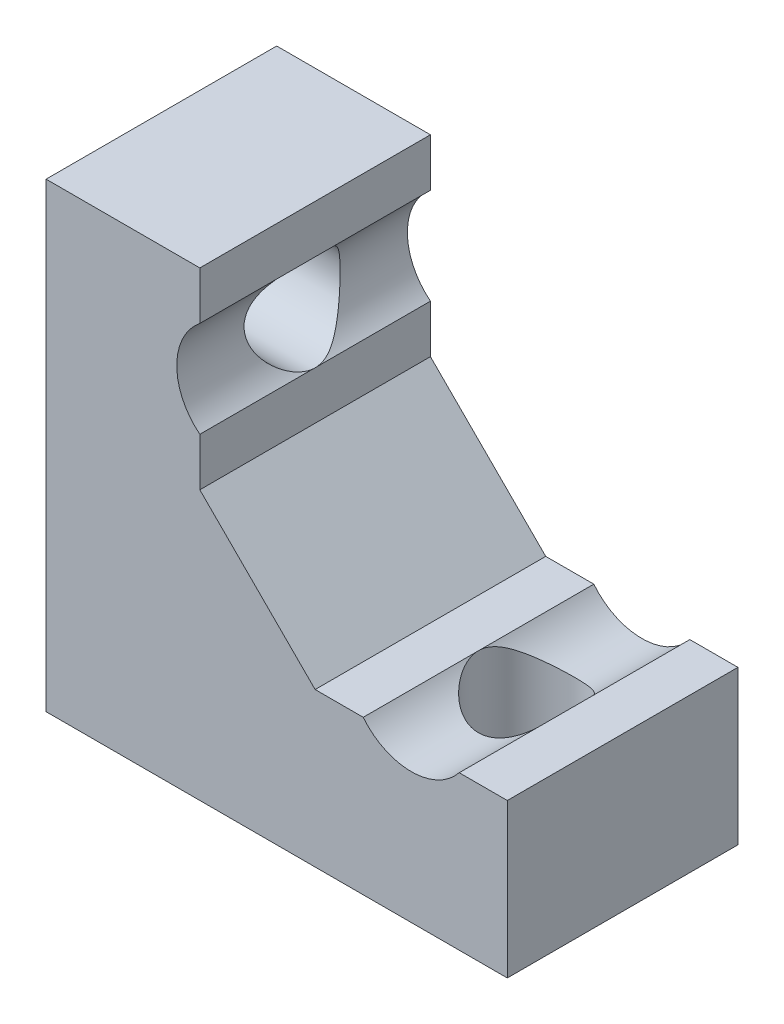
ISO-10303-21;
HEADER;
FILE_DESCRIPTION(('STEP AP214'),'2;1');
FILE_NAME('part.step','',(''),(''),'','','');
FILE_SCHEMA(('AUTOMOTIVE_DESIGN { 1 0 10303 214 1 1 1 1 }'));
ENDSEC;
DATA;
#1=APPLICATION_CONTEXT('core data for automotive mechanical design processes');
#2=APPLICATION_PROTOCOL_DEFINITION('international standard','automotive_design',2000,#1);
#3=PRODUCT_CONTEXT('',#1,'mechanical');
#4=PRODUCT('Part','Part','',(#3));
#5=PRODUCT_RELATED_PRODUCT_CATEGORY('part','',(#4));
#6=PRODUCT_DEFINITION_FORMATION('','',#4);
#7=PRODUCT_DEFINITION_CONTEXT('part definition',#1,'design');
#8=PRODUCT_DEFINITION('design','',#6,#7);
#9=PRODUCT_DEFINITION_SHAPE('','',#8);
#10=(LENGTH_UNIT() NAMED_UNIT(*) SI_UNIT(.MILLI.,.METRE.));
#11=(NAMED_UNIT(*) PLANE_ANGLE_UNIT() SI_UNIT($,.RADIAN.));
#12=(NAMED_UNIT(*) SI_UNIT($,.STERADIAN.) SOLID_ANGLE_UNIT());
#13=UNCERTAINTY_MEASURE_WITH_UNIT(LENGTH_MEASURE(1.E-05),#10,'distance_accuracy_value','');
#14=(GEOMETRIC_REPRESENTATION_CONTEXT(3) GLOBAL_UNCERTAINTY_ASSIGNED_CONTEXT((#13)) GLOBAL_UNIT_ASSIGNED_CONTEXT((#10,
#11,#12)) REPRESENTATION_CONTEXT('',''));
#15=CARTESIAN_POINT('',(0.,0.,0.));
#16=DIRECTION('',(0.,0.,1.));
#17=DIRECTION('',(1.,0.,0.));
#18=AXIS2_PLACEMENT_3D('',#15,#16,#17);
#19=CARTESIAN_POINT('',(12.,4.,6.));
#20=DIRECTION('',(0.,-1.,0.));
#21=DIRECTION('',(1.,0.,0.));
#22=AXIS2_PLACEMENT_3D('',#19,#20,#21);
#23=PLANE('',#22);
#24=DIRECTION('',(-1.,0.,0.));
#25=VECTOR('',#24,1.);
#26=CARTESIAN_POINT('',(12.,4.,0.));
#27=LINE('',#26,#25);
#28=CARTESIAN_POINT('',(12.,4.,0.));
#29=VERTEX_POINT('',#28);
#30=CARTESIAN_POINT('',(10.7489995996797,4.,0.));
#31=VERTEX_POINT('',#30);
#32=EDGE_CURVE('E281',#29,#31,#27,.T.);
#33=ORIENTED_EDGE('',*,*,#32,.T.);
#34=DIRECTION('',(0.,0.,1.));
#35=VECTOR('',#34,1.);
#36=CARTESIAN_POINT('',(10.7489995996797,4.,0.));
#37=LINE('',#36,#35);
#38=CARTESIAN_POINT('',(10.7489995996797,4.,2.95000000000007));
#39=VERTEX_POINT('',#38);
#40=EDGE_CURVE('E283',#31,#39,#37,.T.);
#41=ORIENTED_EDGE('',*,*,#40,.T.);
#42=CARTESIAN_POINT('',(9.5,4.,3.));
#43=DIRECTION('',(0.,1.,0.));
#44=DIRECTION('',(-1.,0.,0.));
#45=AXIS2_PLACEMENT_3D('',#42,#43,#44);
#46=CIRCLE('',#45,1.25);
#47=CARTESIAN_POINT('',(10.7489995996797,4.,3.04999999999993));
#48=VERTEX_POINT('',#47);
#49=EDGE_CURVE('E316',#48,#39,#46,.T.);
#50=ORIENTED_EDGE('',*,*,#49,.F.);
#51=CARTESIAN_POINT('',(10.7489995996797,4.,6.));
#52=VERTEX_POINT('',#51);
#53=EDGE_CURVE('E64',#48,#52,#37,.T.);
#54=ORIENTED_EDGE('',*,*,#53,.T.);
#55=DIRECTION('',(-1.,0.,0.));
#56=VECTOR('',#55,1.);
#57=CARTESIAN_POINT('',(12.,4.,6.));
#58=LINE('',#57,#56);
#59=CARTESIAN_POINT('',(12.,4.,6.));
#60=VERTEX_POINT('',#59);
#61=EDGE_CURVE('E305',#60,#52,#58,.T.);
#62=ORIENTED_EDGE('',*,*,#61,.F.);
#63=DIRECTION('',(0.,0.,-1.));
#64=VECTOR('',#63,1.);
#65=CARTESIAN_POINT('',(12.,4.,6.));
#66=LINE('',#65,#64);
#67=EDGE_CURVE('E201',#60,#29,#66,.T.);
#68=ORIENTED_EDGE('',*,*,#67,.T.);
#69=EDGE_LOOP('',(#33,#41,#50,#54,#62,#68));
#70=FACE_BOUND('',#69,.T.);
#71=ADVANCED_FACE('F35',(#70),#23,.F.);
#72=CARTESIAN_POINT('',(4.,12.,6.));
#73=DIRECTION('',(-1.,0.,0.));
#74=DIRECTION('',(0.,-1.,0.));
#75=AXIS2_PLACEMENT_3D('',#72,#73,#74);
#76=PLANE('',#75);
#77=DIRECTION('',(0.,1.,0.));
#78=VECTOR('',#77,1.);
#79=CARTESIAN_POINT('',(4.,12.,0.));
#80=LINE('',#79,#78);
#81=CARTESIAN_POINT('',(4.,7.,0.));
#82=VERTEX_POINT('',#81);
#83=CARTESIAN_POINT('',(4.,8.25100040032031,0.));
#84=VERTEX_POINT('',#83);
#85=EDGE_CURVE('E166',#82,#84,#80,.T.);
#86=ORIENTED_EDGE('',*,*,#85,.T.);
#87=DIRECTION('',(0.,0.,1.));
#88=VECTOR('',#87,1.);
#89=CARTESIAN_POINT('',(4.,8.25100040032031,0.));
#90=LINE('',#89,#88);
#91=CARTESIAN_POINT('',(4.,8.25100040032031,2.95000000000026));
#92=VERTEX_POINT('',#91);
#93=EDGE_CURVE('E146',#84,#92,#90,.T.);
#94=ORIENTED_EDGE('',*,*,#93,.T.);
#95=CARTESIAN_POINT('',(4.,9.5,3.));
#96=DIRECTION('',(1.,0.,0.));
#97=DIRECTION('',(0.,1.,0.));
#98=AXIS2_PLACEMENT_3D('',#95,#96,#97);
#99=CIRCLE('',#98,1.25);
#100=CARTESIAN_POINT('',(4.,8.25100040032031,3.04999999999974));
#101=VERTEX_POINT('',#100);
#102=EDGE_CURVE('E323',#101,#92,#99,.T.);
#103=ORIENTED_EDGE('',*,*,#102,.F.);
#104=CARTESIAN_POINT('',(4.,8.25100040032031,6.));
#105=VERTEX_POINT('',#104);
#106=EDGE_CURVE('E159',#101,#105,#90,.T.);
#107=ORIENTED_EDGE('',*,*,#106,.T.);
#108=DIRECTION('',(0.,1.,0.));
#109=VECTOR('',#108,1.);
#110=CARTESIAN_POINT('',(4.,12.,6.));
#111=LINE('',#110,#109);
#112=CARTESIAN_POINT('',(4.,7.,6.));
#113=VERTEX_POINT('',#112);
#114=EDGE_CURVE('E299',#113,#105,#111,.T.);
#115=ORIENTED_EDGE('',*,*,#114,.F.);
#116=DIRECTION('',(0.,0.,-1.));
#117=VECTOR('',#116,1.);
#118=CARTESIAN_POINT('',(4.,7.,6.));
#119=LINE('',#118,#117);
#120=EDGE_CURVE('E176',#113,#82,#119,.T.);
#121=ORIENTED_EDGE('',*,*,#120,.T.);
#122=EDGE_LOOP('',(#86,#94,#103,#107,#115,#121));
#123=FACE_BOUND('',#122,.T.);
#124=ADVANCED_FACE('F173',(#123),#76,.F.);
#125=CARTESIAN_POINT('',(0.,0.,6.));
#126=DIRECTION('',(0.,1.,0.));
#127=DIRECTION('',(0.,0.,1.));
#128=AXIS2_PLACEMENT_3D('',#125,#126,#127);
#129=PLANE('',#128);
#130=CARTESIAN_POINT('',(9.5,0.,3.));
#131=DIRECTION('',(0.,1.,0.));
#132=DIRECTION('',(-1.,0.,0.));
#133=AXIS2_PLACEMENT_3D('',#130,#131,#132);
#134=CIRCLE('',#133,1.25);
#135=CARTESIAN_POINT('',(8.25,0.,3.));
#136=VERTEX_POINT('',#135);
#137=EDGE_CURVE('E295',#136,#136,#134,.T.);
#138=ORIENTED_EDGE('',*,*,#137,.T.);
#139=EDGE_LOOP('',(#138));
#140=FACE_BOUND('',#139,.T.);
#141=DIRECTION('',(1.,0.,0.));
#142=VECTOR('',#141,1.);
#143=CARTESIAN_POINT('',(0.,0.,0.));
#144=LINE('',#143,#142);
#145=CARTESIAN_POINT('',(0.,0.,0.));
#146=VERTEX_POINT('',#145);
#147=CARTESIAN_POINT('',(12.,0.,0.));
#148=VERTEX_POINT('',#147);
#149=EDGE_CURVE('E292',#146,#148,#144,.T.);
#150=ORIENTED_EDGE('',*,*,#149,.T.);
#151=DIRECTION('',(0.,0.,-1.));
#152=VECTOR('',#151,1.);
#153=CARTESIAN_POINT('',(12.,0.,6.));
#154=LINE('',#153,#152);
#155=CARTESIAN_POINT('',(12.,0.,6.));
#156=VERTEX_POINT('',#155);
#157=EDGE_CURVE('E204',#156,#148,#154,.T.);
#158=ORIENTED_EDGE('',*,*,#157,.F.);
#159=DIRECTION('',(1.,0.,0.));
#160=VECTOR('',#159,1.);
#161=CARTESIAN_POINT('',(0.,0.,6.));
#162=LINE('',#161,#160);
#163=CARTESIAN_POINT('',(0.,0.,6.));
#164=VERTEX_POINT('',#163);
#165=EDGE_CURVE('E186',#164,#156,#162,.T.);
#166=ORIENTED_EDGE('',*,*,#165,.F.);
#167=DIRECTION('',(0.,0.,-1.));
#168=VECTOR('',#167,1.);
#169=CARTESIAN_POINT('',(0.,0.,6.));
#170=LINE('',#169,#168);
#171=EDGE_CURVE('E187',#164,#146,#170,.T.);
#172=ORIENTED_EDGE('',*,*,#171,.T.);
#173=EDGE_LOOP('',(#150,#158,#166,#172));
#174=FACE_BOUND('',#173,.T.);
#175=ADVANCED_FACE('F37',(#140,#174),#129,.F.);
#176=CARTESIAN_POINT('',(12.,0.,6.));
#177=DIRECTION('',(-1.,0.,0.));
#178=DIRECTION('',(0.,0.,1.));
#179=AXIS2_PLACEMENT_3D('',#176,#177,#178);
#180=PLANE('',#179);
#181=DIRECTION('',(0.,1.,0.));
#182=VECTOR('',#181,1.);
#183=CARTESIAN_POINT('',(12.,0.,0.));
#184=LINE('',#183,#182);
#185=EDGE_CURVE('E289',#148,#29,#184,.T.);
#186=ORIENTED_EDGE('',*,*,#185,.T.);
#187=ORIENTED_EDGE('',*,*,#67,.F.);
#188=DIRECTION('',(0.,1.,0.));
#189=VECTOR('',#188,1.);
#190=CARTESIAN_POINT('',(12.,0.,6.));
#191=LINE('',#190,#189);
#192=EDGE_CURVE('E309',#156,#60,#191,.T.);
#193=ORIENTED_EDGE('',*,*,#192,.F.);
#194=ORIENTED_EDGE('',*,*,#157,.T.);
#195=EDGE_LOOP('',(#186,#187,#193,#194));
#196=FACE_BOUND('',#195,.T.);
#197=ADVANCED_FACE('F265',(#196),#180,.F.);
#198=CARTESIAN_POINT('',(8.25100040032032,4.,6.));
#199=VERTEX_POINT('',#198);
#200=CARTESIAN_POINT('',(7.,4.,6.));
#201=VERTEX_POINT('',#200);
#202=EDGE_CURVE('E308',#199,#201,#58,.T.);
#203=ORIENTED_EDGE('',*,*,#202,.F.);
#204=DIRECTION('',(0.,0.,1.));
#205=VECTOR('',#204,1.);
#206=CARTESIAN_POINT('',(8.25100040032032,4.,0.));
#207=LINE('',#206,#205);
#208=CARTESIAN_POINT('',(8.25100040032032,4.,3.04999999999993));
#209=VERTEX_POINT('',#208);
#210=EDGE_CURVE('E327',#199,#209,#207,.F.);
#211=ORIENTED_EDGE('',*,*,#210,.T.);
#212=CARTESIAN_POINT('',(8.25100040032032,4.,2.95000000000007));
#213=VERTEX_POINT('',#212);
#214=EDGE_CURVE('E313',#213,#209,#46,.T.);
#215=ORIENTED_EDGE('',*,*,#214,.F.);
#216=CARTESIAN_POINT('',(8.25100040032032,4.,0.));
#217=VERTEX_POINT('',#216);
#218=EDGE_CURVE('E56',#213,#217,#207,.F.);
#219=ORIENTED_EDGE('',*,*,#218,.T.);
#220=CARTESIAN_POINT('',(7.,4.,0.));
#221=VERTEX_POINT('',#220);
#222=EDGE_CURVE('E288',#217,#221,#27,.T.);
#223=ORIENTED_EDGE('',*,*,#222,.T.);
#224=DIRECTION('',(0.,0.,-1.));
#225=VECTOR('',#224,1.);
#226=CARTESIAN_POINT('',(7.,4.,6.));
#227=LINE('',#226,#225);
#228=EDGE_CURVE('E198',#201,#221,#227,.T.);
#229=ORIENTED_EDGE('',*,*,#228,.F.);
#230=EDGE_LOOP('',(#203,#211,#215,#219,#223,#229));
#231=FACE_BOUND('',#230,.T.);
#232=ADVANCED_FACE('F262',(#231),#23,.F.);
#233=CARTESIAN_POINT('',(4.,7.,6.));
#234=DIRECTION('',(-0.707106781186547,-0.707106781186547,0.));
#235=DIRECTION('',(0.707106781186548,-0.707106781186548,0.));
#236=AXIS2_PLACEMENT_3D('',#233,#234,#235);
#237=PLANE('',#236);
#238=DIRECTION('',(-0.707106781186548,0.707106781186548,0.));
#239=VECTOR('',#238,1.);
#240=CARTESIAN_POINT('',(4.,7.,0.));
#241=LINE('',#240,#239);
#242=EDGE_CURVE('E181',#221,#82,#241,.T.);
#243=ORIENTED_EDGE('',*,*,#242,.T.);
#244=ORIENTED_EDGE('',*,*,#120,.F.);
#245=DIRECTION('',(-0.707106781186548,0.707106781186548,0.));
#246=VECTOR('',#245,1.);
#247=CARTESIAN_POINT('',(4.,7.,6.));
#248=LINE('',#247,#246);
#249=EDGE_CURVE('E303',#201,#113,#248,.T.);
#250=ORIENTED_EDGE('',*,*,#249,.F.);
#251=ORIENTED_EDGE('',*,*,#228,.T.);
#252=EDGE_LOOP('',(#243,#244,#250,#251));
#253=FACE_BOUND('',#252,.T.);
#254=ADVANCED_FACE('F258',(#253),#237,.F.);
#255=CARTESIAN_POINT('',(4.,10.7489995996797,6.));
#256=VERTEX_POINT('',#255);
#257=CARTESIAN_POINT('',(4.,12.,6.));
#258=VERTEX_POINT('',#257);
#259=EDGE_CURVE('E302',#256,#258,#111,.T.);
#260=ORIENTED_EDGE('',*,*,#259,.F.);
#261=DIRECTION('',(0.,0.,1.));
#262=VECTOR('',#261,1.);
#263=CARTESIAN_POINT('',(4.,10.7489995996797,0.));
#264=LINE('',#263,#262);
#265=CARTESIAN_POINT('',(4.,10.7489995996797,3.04999999999887));
#266=VERTEX_POINT('',#265);
#267=EDGE_CURVE('E330',#256,#266,#264,.F.);
#268=ORIENTED_EDGE('',*,*,#267,.T.);
#269=CARTESIAN_POINT('',(4.,10.7489995996797,2.95000000000113));
#270=VERTEX_POINT('',#269);
#271=EDGE_CURVE('E320',#270,#266,#99,.T.);
#272=ORIENTED_EDGE('',*,*,#271,.F.);
#273=CARTESIAN_POINT('',(4.,10.7489995996797,0.));
#274=VERTEX_POINT('',#273);
#275=EDGE_CURVE('E157',#270,#274,#264,.F.);
#276=ORIENTED_EDGE('',*,*,#275,.T.);
#277=CARTESIAN_POINT('',(4.,12.,0.));
#278=VERTEX_POINT('',#277);
#279=EDGE_CURVE('E168',#274,#278,#80,.T.);
#280=ORIENTED_EDGE('',*,*,#279,.T.);
#281=DIRECTION('',(0.,0.,-1.));
#282=VECTOR('',#281,1.);
#283=CARTESIAN_POINT('',(4.,12.,6.));
#284=LINE('',#283,#282);
#285=EDGE_CURVE('E194',#258,#278,#284,.T.);
#286=ORIENTED_EDGE('',*,*,#285,.F.);
#287=EDGE_LOOP('',(#260,#268,#272,#276,#280,#286));
#288=FACE_BOUND('',#287,.T.);
#289=ADVANCED_FACE('F254',(#288),#76,.F.);
#290=CARTESIAN_POINT('',(0.,12.,6.));
#291=DIRECTION('',(0.,-1.,0.));
#292=DIRECTION('',(0.,0.,-1.));
#293=AXIS2_PLACEMENT_3D('',#290,#291,#292);
#294=PLANE('',#293);
#295=DIRECTION('',(-1.,0.,0.));
#296=VECTOR('',#295,1.);
#297=CARTESIAN_POINT('',(0.,12.,0.));
#298=LINE('',#297,#296);
#299=CARTESIAN_POINT('',(0.,12.,0.));
#300=VERTEX_POINT('',#299);
#301=EDGE_CURVE('E177',#278,#300,#298,.T.);
#302=ORIENTED_EDGE('',*,*,#301,.T.);
#303=DIRECTION('',(0.,0.,-1.));
#304=VECTOR('',#303,1.);
#305=CARTESIAN_POINT('',(0.,12.,6.));
#306=LINE('',#305,#304);
#307=CARTESIAN_POINT('',(0.,12.,6.));
#308=VERTEX_POINT('',#307);
#309=EDGE_CURVE('E190',#308,#300,#306,.T.);
#310=ORIENTED_EDGE('',*,*,#309,.F.);
#311=DIRECTION('',(-1.,0.,0.));
#312=VECTOR('',#311,1.);
#313=CARTESIAN_POINT('',(0.,12.,6.));
#314=LINE('',#313,#312);
#315=EDGE_CURVE('E297',#258,#308,#314,.T.);
#316=ORIENTED_EDGE('',*,*,#315,.F.);
#317=ORIENTED_EDGE('',*,*,#285,.T.);
#318=EDGE_LOOP('',(#302,#310,#316,#317));
#319=FACE_BOUND('',#318,.T.);
#320=ADVANCED_FACE('F250',(#319),#294,.F.);
#321=CARTESIAN_POINT('',(0.,0.,6.));
#322=DIRECTION('',(1.,0.,0.));
#323=DIRECTION('',(0.,0.,-1.));
#324=AXIS2_PLACEMENT_3D('',#321,#322,#323);
#325=PLANE('',#324);
#326=CARTESIAN_POINT('',(0.,9.5,3.));
#327=DIRECTION('',(1.,0.,0.));
#328=DIRECTION('',(0.,1.,0.));
#329=AXIS2_PLACEMENT_3D('',#326,#327,#328);
#330=CIRCLE('',#329,1.25);
#331=CARTESIAN_POINT('',(0.,10.75,3.));
#332=VERTEX_POINT('',#331);
#333=EDGE_CURVE('E317',#332,#332,#330,.T.);
#334=ORIENTED_EDGE('',*,*,#333,.T.);
#335=EDGE_LOOP('',(#334));
#336=FACE_BOUND('',#335,.T.);
#337=DIRECTION('',(0.,-1.,0.));
#338=VECTOR('',#337,1.);
#339=CARTESIAN_POINT('',(0.,0.,0.));
#340=LINE('',#339,#338);
#341=EDGE_CURVE('E179',#300,#146,#340,.T.);
#342=ORIENTED_EDGE('',*,*,#341,.T.);
#343=ORIENTED_EDGE('',*,*,#171,.F.);
#344=DIRECTION('',(0.,-1.,0.));
#345=VECTOR('',#344,1.);
#346=CARTESIAN_POINT('',(0.,0.,6.));
#347=LINE('',#346,#345);
#348=EDGE_CURVE('E191',#308,#164,#347,.T.);
#349=ORIENTED_EDGE('',*,*,#348,.F.);
#350=ORIENTED_EDGE('',*,*,#309,.T.);
#351=EDGE_LOOP('',(#342,#343,#349,#350));
#352=FACE_BOUND('',#351,.T.);
#353=ADVANCED_FACE('F244',(#336,#352),#325,.F.);
#354=CARTESIAN_POINT('',(0.,0.,6.));
#355=DIRECTION('',(0.,0.,1.));
#356=DIRECTION('',(1.,0.,0.));
#357=AXIS2_PLACEMENT_3D('',#354,#355,#356);
#358=PLANE('',#357);
#359=CARTESIAN_POINT('',(9.5,5.,6.));
#360=DIRECTION('',(0.,0.,1.));
#361=DIRECTION('',(1.,0.,0.));
#362=AXIS2_PLACEMENT_3D('',#359,#360,#361);
#363=CIRCLE('',#362,1.6);
#364=EDGE_CURVE('E169',#199,#52,#363,.T.);
#365=ORIENTED_EDGE('',*,*,#364,.F.);
#366=ORIENTED_EDGE('',*,*,#202,.T.);
#367=ORIENTED_EDGE('',*,*,#249,.T.);
#368=ORIENTED_EDGE('',*,*,#114,.T.);
#369=CARTESIAN_POINT('',(4.99999999999997,9.50000000000002,6.));
#370=DIRECTION('',(0.,0.,1.));
#371=DIRECTION('',(-1.,0.,0.));
#372=AXIS2_PLACEMENT_3D('',#369,#370,#371);
#373=CIRCLE('',#372,1.6);
#374=EDGE_CURVE('E170',#256,#105,#373,.T.);
#375=ORIENTED_EDGE('',*,*,#374,.F.);
#376=ORIENTED_EDGE('',*,*,#259,.T.);
#377=ORIENTED_EDGE('',*,*,#315,.T.);
#378=ORIENTED_EDGE('',*,*,#348,.T.);
#379=ORIENTED_EDGE('',*,*,#165,.T.);
#380=ORIENTED_EDGE('',*,*,#192,.T.);
#381=ORIENTED_EDGE('',*,*,#61,.T.);
#382=EDGE_LOOP('',(#365,#366,#367,#368,#375,#376,#377,#378,#379,#380,#381));
#383=FACE_BOUND('',#382,.T.);
#384=ADVANCED_FACE('F240',(#383),#358,.T.);
#385=CARTESIAN_POINT('',(0.,0.,0.));
#386=DIRECTION('',(0.,0.,1.));
#387=DIRECTION('',(1.,0.,0.));
#388=AXIS2_PLACEMENT_3D('',#385,#386,#387);
#389=PLANE('',#388);
#390=ORIENTED_EDGE('',*,*,#222,.F.);
#391=CARTESIAN_POINT('',(9.5,5.,0.));
#392=DIRECTION('',(0.,0.,1.));
#393=DIRECTION('',(1.,0.,0.));
#394=AXIS2_PLACEMENT_3D('',#391,#392,#393);
#395=CIRCLE('',#394,1.6);
#396=EDGE_CURVE('E333',#217,#31,#395,.T.);
#397=ORIENTED_EDGE('',*,*,#396,.T.);
#398=ORIENTED_EDGE('',*,*,#32,.F.);
#399=ORIENTED_EDGE('',*,*,#185,.F.);
#400=ORIENTED_EDGE('',*,*,#149,.F.);
#401=ORIENTED_EDGE('',*,*,#341,.F.);
#402=ORIENTED_EDGE('',*,*,#301,.F.);
#403=ORIENTED_EDGE('',*,*,#279,.F.);
#404=CARTESIAN_POINT('',(4.99999999999997,9.50000000000002,0.));
#405=DIRECTION('',(0.,0.,1.));
#406=DIRECTION('',(-1.,0.,0.));
#407=AXIS2_PLACEMENT_3D('',#404,#405,#406);
#408=CIRCLE('',#407,1.6);
#409=EDGE_CURVE('E149',#274,#84,#408,.T.);
#410=ORIENTED_EDGE('',*,*,#409,.T.);
#411=ORIENTED_EDGE('',*,*,#85,.F.);
#412=ORIENTED_EDGE('',*,*,#242,.F.);
#413=EDGE_LOOP('',(#390,#397,#398,#399,#400,#401,#402,#403,#410,#411,#412));
#414=FACE_BOUND('',#413,.T.);
#415=ADVANCED_FACE('F164',(#414),#389,.F.);
#416=CARTESIAN_POINT('',(9.5,0.,3.));
#417=DIRECTION('',(0.,1.,0.));
#418=DIRECTION('',(-1.,0.,0.));
#419=AXIS2_PLACEMENT_3D('',#416,#417,#418);
#420=CYLINDRICAL_SURFACE('',#419,1.25);
#421=ORIENTED_EDGE('',*,*,#137,.F.);
#422=EDGE_LOOP('',(#421));
#423=FACE_BOUND('',#422,.T.);
#424=ORIENTED_EDGE('',*,*,#214,.T.);
#425=CARTESIAN_POINT('',(8.25100040032032,4.,3.04999999999993));
#426=CARTESIAN_POINT('',(8.25220435483756,3.99850969064022,3.08026696057666));
#427=CARTESIAN_POINT('',(8.25451939461745,3.9956096085078,3.11037881104952));
#428=CARTESIAN_POINT('',(8.26124492086531,3.98731998522594,3.16993012806534));
#429=CARTESIAN_POINT('',(8.26564898231573,3.98193807860524,3.19937136812824));
#430=CARTESIAN_POINT('',(8.28167274401157,3.96271934613813,3.28559325036234));
#431=CARTESIAN_POINT('',(8.29614608085362,3.9457477015169,3.34115270139325));
#432=CARTESIAN_POINT('',(8.336302290871,3.90140751999872,3.46191952509706));
#433=CARTESIAN_POINT('',(8.36392349330529,3.87248211940951,3.52586774856046));
#434=CARTESIAN_POINT('',(8.42849001908789,3.81093373260924,3.64740206939563));
#435=CARTESIAN_POINT('',(8.46549547690375,3.77828767692365,3.70494355321663));
#436=CARTESIAN_POINT('',(8.54928488826963,3.71195038719377,3.8145648479447));
#437=CARTESIAN_POINT('',(8.59629019074352,3.67825342858196,3.86647213788586));
#438=CARTESIAN_POINT('',(8.69916522295679,3.61351323674031,3.96233289280923));
#439=CARTESIAN_POINT('',(8.75500991114056,3.58246287707244,4.00630809780601));
#440=CARTESIAN_POINT('',(8.86549218457535,3.53013327945601,4.07866721283109));
#441=CARTESIAN_POINT('',(8.91886155909758,3.50808597449868,4.10842268149182));
#442=CARTESIAN_POINT('',(9.03097945791833,3.46913945337328,4.16031399641022));
#443=CARTESIAN_POINT('',(9.08972667482925,3.45223899027523,4.18245168840259));
#444=CARTESIAN_POINT('',(9.2118081437363,3.42491830909756,4.21799546712765));
#445=CARTESIAN_POINT('',(9.27517408351677,3.41454871791029,4.23133337543746));
#446=CARTESIAN_POINT('',(9.40397734849854,3.40157687858733,4.24799238257988));
#447=CARTESIAN_POINT('',(9.46941286363206,3.39896802287035,4.25132200261189));
#448=CARTESIAN_POINT('',(9.59148227639006,3.40160114714713,4.2479495292034));
#449=CARTESIAN_POINT('',(9.64817685937222,3.40588657960059,4.24246976581928));
#450=CARTESIAN_POINT('',(9.75958439409213,3.4201993131214,4.22405223089727));
#451=CARTESIAN_POINT('',(9.8142970678487,3.43022741636158,4.21111341743004));
#452=CARTESIAN_POINT('',(9.92061973097315,3.45530676008005,4.17842573597735));
#453=CARTESIAN_POINT('',(9.97221799812137,3.47037573209195,4.15865282039053));
#454=CARTESIAN_POINT('',(10.0712600695131,3.50453690987907,4.11316440902796));
#455=CARTESIAN_POINT('',(10.1187030961446,3.52362986643537,4.08744780421265));
#456=CARTESIAN_POINT('',(10.2159978021257,3.56799728048945,4.02646860806837));
#457=CARTESIAN_POINT('',(10.2650783076657,3.59377125973512,3.99034363390976));
#458=CARTESIAN_POINT('',(10.356824170039,3.64770878011637,3.91213694978777));
#459=CARTESIAN_POINT('',(10.3994798435891,3.67587583002896,3.87004643045114));
#460=CARTESIAN_POINT('',(10.4866074466875,3.7390168238702,3.77094128023122));
#461=CARTESIAN_POINT('',(10.5295198006565,3.7741591650969,3.71265949185729));
#462=CARTESIAN_POINT('',(10.6052143216995,3.84195530004361,3.58845934654587));
#463=CARTESIAN_POINT('',(10.6380022071002,3.87461049063194,3.52254532934563));
#464=CARTESIAN_POINT('',(10.683050867036,3.92246363544887,3.40662335237332));
#465=CARTESIAN_POINT('',(10.6985044607919,3.93983282033802,3.35876107299894));
#466=CARTESIAN_POINT('',(10.7237014134582,3.96901470922567,3.26004334166436));
#467=CARTESIAN_POINT('',(10.7334713549342,3.980853228181,3.20920306801126));
#468=CARTESIAN_POINT('',(10.7422968882166,3.991679638409,3.13971232489642));
#469=CARTESIAN_POINT('',(10.7441724435887,3.99399753213791,3.12189371082001));
#470=CARTESIAN_POINT('',(10.747163034277,3.99770778443021,3.08606670787642));
#471=CARTESIAN_POINT('',(10.748276775383,3.99909856786839,3.06805804857813));
#472=CARTESIAN_POINT('',(10.7489995996797,4.,3.04999999999993));
#473=B_SPLINE_CURVE_WITH_KNOTS('',3,(#425,#426,#427,#428,#429,#430,#431,#432,#433,#434,#435,
#436,#437,#438,#439,#440,#441,#442,#443,#444,#445,#446,#447,#448,#449,#450,#451,#452,#453,#454,
#455,#456,#457,#458,#459,#460,#461,#462,#463,#464,#465,#466,#467,#468,#469,#470,#471,#472),
.UNSPECIFIED.,.F.,.F.,(4,2,2,2,2,2,2,2,2,2,2,2,2,2,2,2,2,2,2,2,2,2,2,4),(0.,0.0908649197417334,
0.181452168693343,0.360027993140649,0.585142750305504,0.811738201099202,1.04399896521162,
1.27561314925168,1.46973089776615,1.66380157971853,1.85935874433923,2.05474936157181,
2.22528270081781,2.39583986705993,2.56700339902791,2.73819889440975,2.93599496674554,
3.13408622995222,3.37450625810752,3.61479024696507,3.77392834721057,3.93231604380367,
3.98648126772955,4.04073828335773),.UNSPECIFIED.);
#474=EDGE_CURVE('E11',#209,#48,#473,.T.);
#475=ORIENTED_EDGE('',*,*,#474,.T.);
#476=ORIENTED_EDGE('',*,*,#49,.T.);
#477=CARTESIAN_POINT('',(10.7489995996797,4.,2.95000000000007));
#478=CARTESIAN_POINT('',(10.7477956451624,3.99850969064022,2.91973303942334));
#479=CARTESIAN_POINT('',(10.7454806053826,3.9956096085078,2.88962118895048));
#480=CARTESIAN_POINT('',(10.7387550791347,3.98731998522594,2.83006987193466));
#481=CARTESIAN_POINT('',(10.7343510176843,3.98193807860524,2.80062863187176));
#482=CARTESIAN_POINT('',(10.7183272559884,3.96271934613813,2.71440674963766));
#483=CARTESIAN_POINT('',(10.7038539191464,3.9457477015169,2.65884729860675));
#484=CARTESIAN_POINT('',(10.663697709129,3.90140751999871,2.53808047490294));
#485=CARTESIAN_POINT('',(10.6360765066947,3.87248211940951,2.47413225143954));
#486=CARTESIAN_POINT('',(10.5715099809121,3.81093373260924,2.35259793060437));
#487=CARTESIAN_POINT('',(10.5345045230962,3.77828767692365,2.29505644678337));
#488=CARTESIAN_POINT('',(10.4507151117304,3.71195038719377,2.1854351520553));
#489=CARTESIAN_POINT('',(10.4037098092565,3.67825342858196,2.13352786211414));
#490=CARTESIAN_POINT('',(10.3008347770432,3.61351323674031,2.03766710719077));
#491=CARTESIAN_POINT('',(10.2449900888594,3.58246287707244,1.99369190219399));
#492=CARTESIAN_POINT('',(10.1345078154247,3.53013327945601,1.92133278716891));
#493=CARTESIAN_POINT('',(10.0811384409024,3.50808597449868,1.89157731850818));
#494=CARTESIAN_POINT('',(9.96902054208168,3.46913945337328,1.83968600358978));
#495=CARTESIAN_POINT('',(9.91027332517076,3.45223899027523,1.81754831159741));
#496=CARTESIAN_POINT('',(9.7881918562637,3.42491830909756,1.78200453287235));
#497=CARTESIAN_POINT('',(9.72482591648323,3.41454871791029,1.76866662456254));
#498=CARTESIAN_POINT('',(9.59602265150146,3.40157687858733,1.75200761742012));
#499=CARTESIAN_POINT('',(9.53058713636795,3.39896802287035,1.74867799738811));
#500=CARTESIAN_POINT('',(9.40851772360994,3.40160114714713,1.7520504707966));
#501=CARTESIAN_POINT('',(9.35182314062779,3.40588657960059,1.75753023418072));
#502=CARTESIAN_POINT('',(9.24041560590787,3.4201993131214,1.77594776910273));
#503=CARTESIAN_POINT('',(9.18570293215131,3.43022741636158,1.78888658256996));
#504=CARTESIAN_POINT('',(9.07938026902685,3.45530676008005,1.82157426402265));
#505=CARTESIAN_POINT('',(9.02778200187863,3.47037573209195,1.84134717960947));
#506=CARTESIAN_POINT('',(8.92873993048694,3.50453690987907,1.88683559097204));
#507=CARTESIAN_POINT('',(8.88129690385538,3.52362986643537,1.91255219578735));
#508=CARTESIAN_POINT('',(8.78400219787431,3.56799728048945,1.97353139193163));
#509=CARTESIAN_POINT('',(8.73492169233433,3.59377125973512,2.00965636609024));
#510=CARTESIAN_POINT('',(8.64317582996101,3.64770878011637,2.08786305021223));
#511=CARTESIAN_POINT('',(8.60052015641094,3.67587583002896,2.12995356954886));
#512=CARTESIAN_POINT('',(8.51339255331251,3.7390168238702,2.22905871976878));
#513=CARTESIAN_POINT('',(8.47048019934348,3.7741591650969,2.28734050814271));
#514=CARTESIAN_POINT('',(8.3947856783005,3.84195530004361,2.41154065345412));
#515=CARTESIAN_POINT('',(8.36199779289984,3.87461049063195,2.47745467065436));
#516=CARTESIAN_POINT('',(8.316949132964,3.92246363544887,2.59337664762668));
#517=CARTESIAN_POINT('',(8.30149553920809,3.93983282033802,2.64123892700106));
#518=CARTESIAN_POINT('',(8.27629858654178,3.96901470922567,2.73995665833564));
#519=CARTESIAN_POINT('',(8.26652864506584,3.980853228181,2.79079693198874));
#520=CARTESIAN_POINT('',(8.25770311178345,3.99167963840901,2.86028767510358));
#521=CARTESIAN_POINT('',(8.25582755641134,3.99399753213791,2.87810628917999));
#522=CARTESIAN_POINT('',(8.25283696572305,3.99770778443021,2.91393329212358));
#523=CARTESIAN_POINT('',(8.25172322461704,3.99909856786839,2.93194195142187));
#524=CARTESIAN_POINT('',(8.25100040032032,4.,2.95000000000007));
#525=B_SPLINE_CURVE_WITH_KNOTS('',3,(#477,#478,#479,#480,#481,#482,#483,#484,#485,#486,#487,
#488,#489,#490,#491,#492,#493,#494,#495,#496,#497,#498,#499,#500,#501,#502,#503,#504,#505,#506,
#507,#508,#509,#510,#511,#512,#513,#514,#515,#516,#517,#518,#519,#520,#521,#522,#523,#524),
.UNSPECIFIED.,.F.,.F.,(4,2,2,2,2,2,2,2,2,2,2,2,2,2,2,2,2,2,2,2,2,2,2,4),(0.,0.0908649197417337,
0.181452168693343,0.36002799314065,0.585142750305504,0.811738201099202,1.04399896521162,
1.27561314925168,1.46973089776615,1.66380157971853,1.85935874433923,2.05474936157181,
2.2252827008178,2.39583986705993,2.56700339902791,2.73819889440975,2.93599496674554,
3.13408622995222,3.37450625810751,3.61479024696507,3.77392834721057,3.93231604380367,
3.98648126772955,4.04073828335772),.UNSPECIFIED.);
#526=EDGE_CURVE('E49',#39,#213,#525,.T.);
#527=ORIENTED_EDGE('',*,*,#526,.T.);
#528=EDGE_LOOP('',(#424,#475,#476,#527));
#529=FACE_BOUND('',#528,.T.);
#530=ADVANCED_FACE('F235',(#423,#529),#420,.F.);
#531=CARTESIAN_POINT('',(0.,9.5,3.));
#532=DIRECTION('',(1.,0.,0.));
#533=DIRECTION('',(0.,1.,0.));
#534=AXIS2_PLACEMENT_3D('',#531,#532,#533);
#535=CYLINDRICAL_SURFACE('',#534,1.25);
#536=ORIENTED_EDGE('',*,*,#333,.F.);
#537=EDGE_LOOP('',(#536));
#538=FACE_BOUND('',#537,.T.);
#539=ORIENTED_EDGE('',*,*,#102,.T.);
#540=CARTESIAN_POINT('',(4.,8.25100040032031,2.95000000000026));
#541=CARTESIAN_POINT('',(3.99850969064022,8.25220435483754,2.91973303942355));
#542=CARTESIAN_POINT('',(3.99560960850781,8.25451939461743,2.88962118895069));
#543=CARTESIAN_POINT('',(3.98731998522596,8.26124492086528,2.83006987193488));
#544=CARTESIAN_POINT('',(3.98193807860527,8.26564898231569,2.80062863187197));
#545=CARTESIAN_POINT('',(3.96271934613818,8.28167274401151,2.71440674963789));
#546=CARTESIAN_POINT('',(3.94574770151696,8.29614608085355,2.65884729860698));
#547=CARTESIAN_POINT('',(3.90140751999881,8.3363022908709,2.53808047490319));
#548=CARTESIAN_POINT('',(3.87248211940961,8.36392349330517,2.47413225143979));
#549=CARTESIAN_POINT('',(3.81093373260937,8.42849001908773,2.35259793060463));
#550=CARTESIAN_POINT('',(3.77828767692379,8.46549547690357,2.29505644678364));
#551=CARTESIAN_POINT('',(3.71195038719393,8.5492848882694,2.18543515205557));
#552=CARTESIAN_POINT('',(3.67825342858212,8.59629019074325,2.13352786211441));
#553=CARTESIAN_POINT('',(3.61351323674047,8.69916522295647,2.03766710719104));
#554=CARTESIAN_POINT('',(3.5824628770726,8.75500991114021,1.99369190219425));
#555=CARTESIAN_POINT('',(3.53013327945615,8.86549218457496,1.92133278716914));
#556=CARTESIAN_POINT('',(3.50808597449881,8.91886155909719,1.89157731850838));
#557=CARTESIAN_POINT('',(3.46913945337337,9.03097945791794,1.83968600358993));
#558=CARTESIAN_POINT('',(3.4522389902753,9.08972667482886,1.81754831159754));
#559=CARTESIAN_POINT('',(3.4249183090976,9.21180814373593,1.78200453287244));
#560=CARTESIAN_POINT('',(3.41454871791031,9.27517408351641,1.76866662456261));
#561=CARTESIAN_POINT('',(3.40157687858732,9.4039773484982,1.75200761742014));
#562=CARTESIAN_POINT('',(3.39896802287032,9.46941286363173,1.74867799738811));
#563=CARTESIAN_POINT('',(3.40160114714708,9.59148227638976,1.75205047079658));
#564=CARTESIAN_POINT('',(3.40588657960053,9.64817685937192,1.75753023418068));
#565=CARTESIAN_POINT('',(3.42019931312132,9.75958439409186,1.77594776910267));
#566=CARTESIAN_POINT('',(3.4302274163615,9.81429706784843,1.78888658256989));
#567=CARTESIAN_POINT('',(3.45530676007994,9.92061973097289,1.82157426402255));
#568=CARTESIAN_POINT('',(3.47037573209183,9.97221799812112,1.84134717960937));
#569=CARTESIAN_POINT('',(3.50453690987894,10.0712600695128,1.88683559097192));
#570=CARTESIAN_POINT('',(3.52362986643523,10.1187030961444,1.91255219578721));
#571=CARTESIAN_POINT('',(3.56799728048929,10.2159978021255,1.97353139193146));
#572=CARTESIAN_POINT('',(3.59377125973495,10.2650783076654,2.00965636609006));
#573=CARTESIAN_POINT('',(3.64770878011618,10.3568241700388,2.08786305021202));
#574=CARTESIAN_POINT('',(3.67587583002877,10.3994798435888,2.12995356954863));
#575=CARTESIAN_POINT('',(3.73901682387,10.4866074466873,2.22905871976851));
#576=CARTESIAN_POINT('',(3.77415916509669,10.5295198006563,2.28734050814242));
#577=CARTESIAN_POINT('',(3.84195530004339,10.6052143216993,2.41154065345379));
#578=CARTESIAN_POINT('',(3.87461049063173,10.6380022071,2.47745467065401));
#579=CARTESIAN_POINT('',(3.92246363544867,10.6830508670359,2.59337664762628));
#580=CARTESIAN_POINT('',(3.93983282033783,10.6985044607918,2.64123892700064));
#581=CARTESIAN_POINT('',(3.9690147092255,10.7237014134581,2.73995665833518));
#582=CARTESIAN_POINT('',(3.98085322818085,10.7334713549341,2.79079693198827));
#583=CARTESIAN_POINT('',(3.99167963840892,10.7422968882165,2.86028767510333));
#584=CARTESIAN_POINT('',(3.99399753213786,10.7441724435887,2.87810628918001));
#585=CARTESIAN_POINT('',(3.99770778443021,10.747163034277,2.91393329212412));
#586=CARTESIAN_POINT('',(3.9990985678684,10.748276775383,2.93194195142267));
#587=CARTESIAN_POINT('',(4.,10.7489995996797,2.95000000000113));
#588=B_SPLINE_CURVE_WITH_KNOTS('',3,(#540,#541,#542,#543,#544,#545,#546,#547,#548,#549,#550,
#551,#552,#553,#554,#555,#556,#557,#558,#559,#560,#561,#562,#563,#564,#565,#566,#567,#568,#569,
#570,#571,#572,#573,#574,#575,#576,#577,#578,#579,#580,#581,#582,#583,#584,#585,#586,#587),
.UNSPECIFIED.,.F.,.F.,(4,2,2,2,2,2,2,2,2,2,2,2,2,2,2,2,2,2,2,2,2,2,2,4),(0.,0.0908649197417165,
0.18145216869331,0.360027993140581,0.58514275030538,0.81173820109902,1.04399896521139,
1.2756131492514,1.46973089776591,1.66380157971833,1.85935874433908,2.05474936157171,
2.22528270081772,2.39583986705986,2.56700339902783,2.73819889440965,2.93599496674541,
3.13408622995206,3.37450625810732,3.61479024696484,3.77392834721029,3.93231604380336,
3.98648126773003,4.04073828335899),.UNSPECIFIED.);
#589=EDGE_CURVE('E152',#92,#270,#588,.T.);
#590=ORIENTED_EDGE('',*,*,#589,.T.);
#591=ORIENTED_EDGE('',*,*,#271,.T.);
#592=CARTESIAN_POINT('',(4.,10.7489995996797,3.04999999999887));
#593=CARTESIAN_POINT('',(3.99850969064025,10.7477956451625,3.08026696057556));
#594=CARTESIAN_POINT('',(3.99560960850787,10.7454806053826,3.1103788110484));
#595=CARTESIAN_POINT('',(3.98731998522608,10.7387550791348,3.16993012806418));
#596=CARTESIAN_POINT('',(3.98193807860542,10.7343510176845,3.19937136812707));
#597=CARTESIAN_POINT('',(3.96271934613841,10.7183272559887,3.2855932503611));
#598=CARTESIAN_POINT('',(3.94574770151725,10.7038539191467,3.34115270139199));
#599=CARTESIAN_POINT('',(3.90140751999922,10.6636977091295,3.46191952509573));
#600=CARTESIAN_POINT('',(3.8724821194101,10.6360765066953,3.52586774855909));
#601=CARTESIAN_POINT('',(3.81093373260998,10.571509980913,3.64740206939421));
#602=CARTESIAN_POINT('',(3.77828767692444,10.5345045230972,3.70494355321518));
#603=CARTESIAN_POINT('',(3.71195038719466,10.4507151117316,3.81456484794323));
#604=CARTESIAN_POINT('',(3.67825342858288,10.4037098092579,3.86647213788439));
#605=CARTESIAN_POINT('',(3.61351323674127,10.3008347770449,3.9623328928078));
#606=CARTESIAN_POINT('',(3.58246287707339,10.2449900888613,4.00630809780461));
#607=CARTESIAN_POINT('',(3.53013327945686,10.1345078154267,4.07866721282987));
#608=CARTESIAN_POINT('',(3.50808597449945,10.0811384409045,4.10842268149073));
#609=CARTESIAN_POINT('',(3.46913945337388,9.96902054208375,4.16031399640939));
#610=CARTESIAN_POINT('',(3.45223899027574,9.91027332517281,4.18245168840188));
#611=CARTESIAN_POINT('',(3.42491830909789,9.7881918562657,4.21799546712718));
#612=CARTESIAN_POINT('',(3.41454871791053,9.72482591648518,4.2313333754371));
#613=CARTESIAN_POINT('',(3.40157687858741,9.59602265150329,4.24799238257974));
#614=CARTESIAN_POINT('',(3.39896802287035,9.5305871363697,4.25132200261185));
#615=CARTESIAN_POINT('',(3.401601147147,9.40851772361158,4.24794952920352));
#616=CARTESIAN_POINT('',(3.40588657960041,9.35182314062939,4.24246976581947));
#617=CARTESIAN_POINT('',(3.42019931312112,9.24041560590938,4.22405223089759));
#618=CARTESIAN_POINT('',(3.43022741636126,9.18570293215277,4.21111341743042));
#619=CARTESIAN_POINT('',(3.45530676007964,9.07938026902825,4.17842573597785));
#620=CARTESIAN_POINT('',(3.47037573209149,9.02778200188002,4.1586528203911));
#621=CARTESIAN_POINT('',(3.50453690987853,8.92873993048829,4.11316440902865));
#622=CARTESIAN_POINT('',(3.52362986643479,8.88129690385671,4.08744780421341));
#623=CARTESIAN_POINT('',(3.56799728048878,8.7840021978756,4.02646860806928));
#624=CARTESIAN_POINT('',(3.5937712597344,8.73492169233561,3.99034363391075));
#625=CARTESIAN_POINT('',(3.64770878011556,8.64317582996225,3.91213694978894));
#626=CARTESIAN_POINT('',(3.67587583002812,8.60052015641216,3.87004643045239));
#627=CARTESIAN_POINT('',(3.73901682386929,8.51339255331365,3.77094128023268));
#628=CARTESIAN_POINT('',(3.77415916509596,8.47048019934457,3.71265949185887));
#629=CARTESIAN_POINT('',(3.84195530004267,8.39478567830147,3.58845934654769));
#630=CARTESIAN_POINT('',(3.87461049063102,8.36199779290073,3.52254532934757));
#631=CARTESIAN_POINT('',(3.92246363544808,8.31694913296471,3.40662335237539));
#632=CARTESIAN_POINT('',(3.93983282033731,8.3014955392087,3.35876107300099));
#633=CARTESIAN_POINT('',(3.96901470922515,8.27629858654221,3.26004334166638));
#634=CARTESIAN_POINT('',(3.98085322818058,8.26652864506617,3.20920306801325));
#635=CARTESIAN_POINT('',(3.99167963840878,8.25770311178362,3.13971232489803));
#636=CARTESIAN_POINT('',(3.99399753213775,8.25582755641146,3.12189371082126));
#637=CARTESIAN_POINT('',(3.99770778443016,8.25283696572308,3.08606670787695));
#638=CARTESIAN_POINT('',(3.99909856786837,8.25172322461704,3.0680580485783));
#639=CARTESIAN_POINT('',(4.,8.25100040032031,3.04999999999974));
#640=B_SPLINE_CURVE_WITH_KNOTS('',3,(#592,#593,#594,#595,#596,#597,#598,#599,#600,#601,#602,
#603,#604,#605,#606,#607,#608,#609,#610,#611,#612,#613,#614,#615,#616,#617,#618,#619,#620,#621,
#622,#623,#624,#625,#626,#627,#628,#629,#630,#631,#632,#633,#634,#635,#636,#637,#638,#639),
.UNSPECIFIED.,.F.,.F.,(4,2,2,2,2,2,2,2,2,2,2,2,2,2,2,2,2,2,2,2,2,2,2,4),(0.,0.0908649197416432,
0.181452168693164,0.360027993140287,0.585142750304833,0.811738201098222,1.04399896521034,
1.27561314925011,1.46973089776481,1.66380157971743,1.85935874433838,2.0547493615712,
2.22528270081727,2.39583986705948,2.56700339902739,2.73819889440916,2.93599496674478,
3.1340862299513,3.37450625810639,3.61479024696376,3.77392834720945,3.93231604380275,
3.98648126772972,4.04073828335899),.UNSPECIFIED.);
#641=EDGE_CURVE('E207',#266,#101,#640,.T.);
#642=ORIENTED_EDGE('',*,*,#641,.T.);
#643=EDGE_LOOP('',(#539,#590,#591,#642));
#644=FACE_BOUND('',#643,.T.);
#645=ADVANCED_FACE('F220',(#538,#644),#535,.F.);
#646=CARTESIAN_POINT('',(4.99999999999997,9.50000000000002,0.));
#647=DIRECTION('',(0.,0.,1.));
#648=DIRECTION('',(1.,0.,0.));
#649=AXIS2_PLACEMENT_3D('',#646,#647,#648);
#650=CYLINDRICAL_SURFACE('',#649,1.6);
#651=ORIENTED_EDGE('',*,*,#641,.F.);
#652=ORIENTED_EDGE('',*,*,#267,.F.);
#653=ORIENTED_EDGE('',*,*,#374,.T.);
#654=ORIENTED_EDGE('',*,*,#106,.F.);
#655=EDGE_LOOP('',(#651,#652,#653,#654));
#656=FACE_BOUND('',#655,.T.);
#657=ADVANCED_FACE('F225',(#656),#650,.F.);
#658=ORIENTED_EDGE('',*,*,#409,.F.);
#659=ORIENTED_EDGE('',*,*,#275,.F.);
#660=ORIENTED_EDGE('',*,*,#589,.F.);
#661=ORIENTED_EDGE('',*,*,#93,.F.);
#662=EDGE_LOOP('',(#658,#659,#660,#661));
#663=FACE_BOUND('',#662,.T.);
#664=ADVANCED_FACE('F148',(#663),#650,.F.);
#665=CARTESIAN_POINT('',(9.5,5.,0.));
#666=DIRECTION('',(0.,0.,1.));
#667=DIRECTION('',(1.,0.,0.));
#668=AXIS2_PLACEMENT_3D('',#665,#666,#667);
#669=CYLINDRICAL_SURFACE('',#668,1.6);
#670=ORIENTED_EDGE('',*,*,#396,.F.);
#671=ORIENTED_EDGE('',*,*,#218,.F.);
#672=ORIENTED_EDGE('',*,*,#526,.F.);
#673=ORIENTED_EDGE('',*,*,#40,.F.);
#674=EDGE_LOOP('',(#670,#671,#672,#673));
#675=FACE_BOUND('',#674,.T.);
#676=ADVANCED_FACE('F224',(#675),#669,.F.);
#677=ORIENTED_EDGE('',*,*,#474,.F.);
#678=ORIENTED_EDGE('',*,*,#210,.F.);
#679=ORIENTED_EDGE('',*,*,#364,.T.);
#680=ORIENTED_EDGE('',*,*,#53,.F.);
#681=EDGE_LOOP('',(#677,#678,#679,#680));
#682=FACE_BOUND('',#681,.T.);
#683=ADVANCED_FACE('F226',(#682),#669,.F.);
#684=CLOSED_SHELL('',(#71,#124,#175,#197,#232,#254,#289,#320,#353,#384,#415,#530,#645,#657,#664,
#676,#683));
#685=MANIFOLD_SOLID_BREP('B2',#684);
#686=ADVANCED_BREP_SHAPE_REPRESENTATION('',(#18,#685),#14);
#687=SHAPE_DEFINITION_REPRESENTATION(#9,#686);
ENDSEC;
END-ISO-10303-21;
